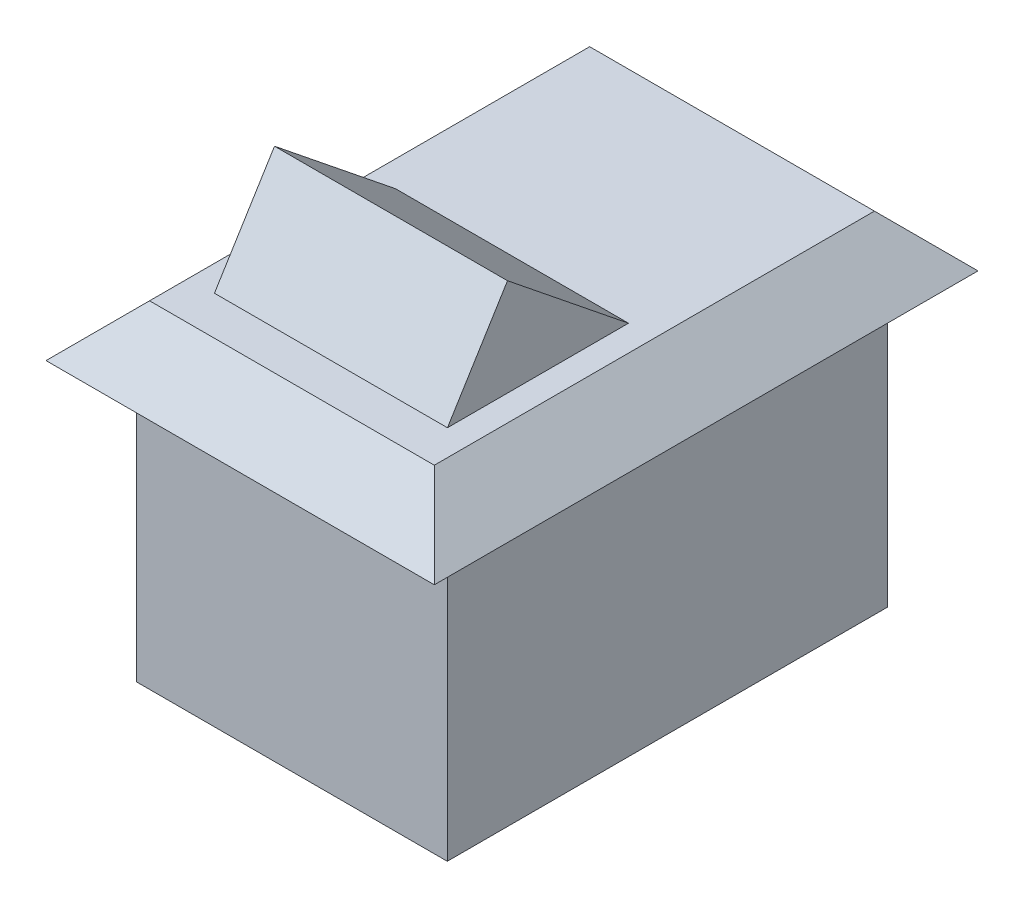
ISO-10303-21;
HEADER;
FILE_DESCRIPTION(('STEP AP214'),'2;1');
FILE_NAME('part.step','',(''),(''),'','','');
FILE_SCHEMA(('AUTOMOTIVE_DESIGN { 1 0 10303 214 1 1 1 1 }'));
ENDSEC;
DATA;
#1=APPLICATION_CONTEXT('core data for automotive mechanical design processes');
#2=APPLICATION_PROTOCOL_DEFINITION('international standard','automotive_design',2000,#1);
#3=PRODUCT_CONTEXT('',#1,'mechanical');
#4=PRODUCT('Part','Part','',(#3));
#5=PRODUCT_RELATED_PRODUCT_CATEGORY('part','',(#4));
#6=PRODUCT_DEFINITION_FORMATION('','',#4);
#7=PRODUCT_DEFINITION_CONTEXT('part definition',#1,'design');
#8=PRODUCT_DEFINITION('design','',#6,#7);
#9=PRODUCT_DEFINITION_SHAPE('','',#8);
#10=(LENGTH_UNIT() NAMED_UNIT(*) SI_UNIT(.MILLI.,.METRE.));
#11=(NAMED_UNIT(*) PLANE_ANGLE_UNIT() SI_UNIT($,.RADIAN.));
#12=(NAMED_UNIT(*) SI_UNIT($,.STERADIAN.) SOLID_ANGLE_UNIT());
#13=UNCERTAINTY_MEASURE_WITH_UNIT(LENGTH_MEASURE(1.E-05),#10,'distance_accuracy_value','');
#14=(GEOMETRIC_REPRESENTATION_CONTEXT(3) GLOBAL_UNCERTAINTY_ASSIGNED_CONTEXT((#13)) GLOBAL_UNIT_ASSIGNED_CONTEXT((#10,
#11,#12)) REPRESENTATION_CONTEXT('',''));
#15=CARTESIAN_POINT('',(0.,0.,0.));
#16=DIRECTION('',(0.,0.,1.));
#17=DIRECTION('',(1.,0.,0.));
#18=AXIS2_PLACEMENT_3D('',#15,#16,#17);
#19=CARTESIAN_POINT('',(0.,13.,0.));
#20=DIRECTION('',(0.,-1.,0.));
#21=DIRECTION('',(0.,0.,-1.));
#22=AXIS2_PLACEMENT_3D('',#19,#20,#21);
#23=PLANE('',#22);
#24=DIRECTION('',(0.,0.,-1.));
#25=VECTOR('',#24,1.);
#26=CARTESIAN_POINT('',(5.49999999999999,13.,0.));
#27=LINE('',#26,#25);
#28=CARTESIAN_POINT('',(5.49999999999999,13.,8.49999999999999));
#29=VERTEX_POINT('',#28);
#30=CARTESIAN_POINT('',(5.49999999999999,13.,-8.5));
#31=VERTEX_POINT('',#30);
#32=EDGE_CURVE('E44',#29,#31,#27,.T.);
#33=ORIENTED_EDGE('',*,*,#32,.T.);
#34=DIRECTION('',(-1.,0.,0.));
#35=VECTOR('',#34,1.);
#36=CARTESIAN_POINT('',(0.,13.,-8.5));
#37=LINE('',#36,#35);
#38=CARTESIAN_POINT('',(-5.5,13.,-8.5));
#39=VERTEX_POINT('',#38);
#40=EDGE_CURVE('E11',#31,#39,#37,.T.);
#41=ORIENTED_EDGE('',*,*,#40,.T.);
#42=DIRECTION('',(0.,0.,1.));
#43=VECTOR('',#42,1.);
#44=CARTESIAN_POINT('',(-5.5,13.,0.));
#45=LINE('',#44,#43);
#46=CARTESIAN_POINT('',(-5.5,13.,8.49999999999999));
#47=VERTEX_POINT('',#46);
#48=EDGE_CURVE('E190',#39,#47,#45,.T.);
#49=ORIENTED_EDGE('',*,*,#48,.T.);
#50=DIRECTION('',(1.,0.,0.));
#51=VECTOR('',#50,1.);
#52=CARTESIAN_POINT('',(0.,13.,8.49999999999999));
#53=LINE('',#52,#51);
#54=EDGE_CURVE('E192',#47,#29,#53,.T.);
#55=ORIENTED_EDGE('',*,*,#54,.T.);
#56=EDGE_LOOP('',(#33,#41,#49,#55));
#57=FACE_BOUND('',#56,.T.);
#58=DIRECTION('',(0.,0.,-1.));
#59=VECTOR('',#58,1.);
#60=CARTESIAN_POINT('',(4.5,13.,0.));
#61=LINE('',#60,#59);
#62=CARTESIAN_POINT('',(4.5,13.,6.99358473484899));
#63=VERTEX_POINT('',#62);
#64=CARTESIAN_POINT('',(4.5,13.,0.));
#65=VERTEX_POINT('',#64);
#66=EDGE_CURVE('E125',#63,#65,#61,.T.);
#67=ORIENTED_EDGE('',*,*,#66,.F.);
#68=DIRECTION('',(-1.,0.,0.));
#69=VECTOR('',#68,1.);
#70=CARTESIAN_POINT('',(4.5,13.,6.99358473484899));
#71=LINE('',#70,#69);
#72=CARTESIAN_POINT('',(-4.5,13.,6.99358473484899));
#73=VERTEX_POINT('',#72);
#74=EDGE_CURVE('E141',#63,#73,#71,.T.);
#75=ORIENTED_EDGE('',*,*,#74,.T.);
#76=DIRECTION('',(0.,0.,-1.));
#77=VECTOR('',#76,1.);
#78=CARTESIAN_POINT('',(-4.5,13.,0.));
#79=LINE('',#78,#77);
#80=CARTESIAN_POINT('',(-4.5,13.,0.));
#81=VERTEX_POINT('',#80);
#82=EDGE_CURVE('E136',#73,#81,#79,.T.);
#83=ORIENTED_EDGE('',*,*,#82,.T.);
#84=DIRECTION('',(-1.,0.,0.));
#85=VECTOR('',#84,1.);
#86=CARTESIAN_POINT('',(4.5,13.,0.));
#87=LINE('',#86,#85);
#88=EDGE_CURVE('E52',#65,#81,#87,.T.);
#89=ORIENTED_EDGE('',*,*,#88,.F.);
#90=EDGE_LOOP('',(#67,#75,#83,#89));
#91=FACE_BOUND('',#90,.T.);
#92=ADVANCED_FACE('F35',(#57,#91),#23,.F.);
#93=CARTESIAN_POINT('',(6.,11.,8.5));
#94=DIRECTION('',(-1.,0.,0.));
#95=DIRECTION('',(0.,0.,1.));
#96=AXIS2_PLACEMENT_3D('',#93,#94,#95);
#97=PLANE('',#96);
#98=DIRECTION('',(0.,0.,-1.));
#99=VECTOR('',#98,1.);
#100=CARTESIAN_POINT('',(6.,0.,8.5));
#101=LINE('',#100,#99);
#102=CARTESIAN_POINT('',(6.,0.,8.5));
#103=VERTEX_POINT('',#102);
#104=CARTESIAN_POINT('',(6.,0.,-8.5));
#105=VERTEX_POINT('',#104);
#106=EDGE_CURVE('E157',#103,#105,#101,.T.);
#107=ORIENTED_EDGE('',*,*,#106,.T.);
#108=DIRECTION('',(0.,-1.,0.));
#109=VECTOR('',#108,1.);
#110=CARTESIAN_POINT('',(6.,11.,-8.5));
#111=LINE('',#110,#109);
#112=CARTESIAN_POINT('',(6.,11.,-8.5));
#113=VERTEX_POINT('',#112);
#114=EDGE_CURVE('E187',#113,#105,#111,.T.);
#115=ORIENTED_EDGE('',*,*,#114,.F.);
#116=DIRECTION('',(0.,0.,-1.));
#117=VECTOR('',#116,1.);
#118=CARTESIAN_POINT('',(6.,11.,8.5));
#119=LINE('',#118,#117);
#120=CARTESIAN_POINT('',(6.,11.,8.5));
#121=VERTEX_POINT('',#120);
#122=EDGE_CURVE('E158',#121,#113,#119,.T.);
#123=ORIENTED_EDGE('',*,*,#122,.F.);
#124=DIRECTION('',(0.,-1.,0.));
#125=VECTOR('',#124,1.);
#126=CARTESIAN_POINT('',(6.,11.,8.5));
#127=LINE('',#126,#125);
#128=EDGE_CURVE('E171',#121,#103,#127,.T.);
#129=ORIENTED_EDGE('',*,*,#128,.T.);
#130=EDGE_LOOP('',(#107,#115,#123,#129));
#131=FACE_BOUND('',#130,.T.);
#132=ADVANCED_FACE('F216',(#131),#97,.F.);
#133=CARTESIAN_POINT('',(-6.,11.,-8.5));
#134=DIRECTION('',(0.,0.,1.));
#135=DIRECTION('',(1.,0.,0.));
#136=AXIS2_PLACEMENT_3D('',#133,#134,#135);
#137=PLANE('',#136);
#138=DIRECTION('',(-1.,0.,0.));
#139=VECTOR('',#138,1.);
#140=CARTESIAN_POINT('',(-6.,0.,-8.5));
#141=LINE('',#140,#139);
#142=CARTESIAN_POINT('',(-6.,0.,-8.5));
#143=VERTEX_POINT('',#142);
#144=EDGE_CURVE('E174',#105,#143,#141,.T.);
#145=ORIENTED_EDGE('',*,*,#144,.T.);
#146=DIRECTION('',(0.,-1.,0.));
#147=VECTOR('',#146,1.);
#148=CARTESIAN_POINT('',(-6.,11.,-8.5));
#149=LINE('',#148,#147);
#150=CARTESIAN_POINT('',(-6.,11.,-8.5));
#151=VERTEX_POINT('',#150);
#152=EDGE_CURVE('E184',#151,#143,#149,.T.);
#153=ORIENTED_EDGE('',*,*,#152,.F.);
#154=DIRECTION('',(-1.,0.,0.));
#155=VECTOR('',#154,1.);
#156=CARTESIAN_POINT('',(-6.,11.,-8.5));
#157=LINE('',#156,#155);
#158=EDGE_CURVE('E161',#113,#151,#157,.T.);
#159=ORIENTED_EDGE('',*,*,#158,.F.);
#160=ORIENTED_EDGE('',*,*,#114,.T.);
#161=EDGE_LOOP('',(#145,#153,#159,#160));
#162=FACE_BOUND('',#161,.T.);
#163=ADVANCED_FACE('F221',(#162),#137,.F.);
#164=CARTESIAN_POINT('',(-6.,11.,8.5));
#165=DIRECTION('',(1.,0.,0.));
#166=DIRECTION('',(0.,0.,-1.));
#167=AXIS2_PLACEMENT_3D('',#164,#165,#166);
#168=PLANE('',#167);
#169=DIRECTION('',(0.,0.,1.));
#170=VECTOR('',#169,1.);
#171=CARTESIAN_POINT('',(-6.,0.,8.5));
#172=LINE('',#171,#170);
#173=CARTESIAN_POINT('',(-6.,0.,8.5));
#174=VERTEX_POINT('',#173);
#175=EDGE_CURVE('E176',#143,#174,#172,.T.);
#176=ORIENTED_EDGE('',*,*,#175,.T.);
#177=DIRECTION('',(0.,-1.,0.));
#178=VECTOR('',#177,1.);
#179=CARTESIAN_POINT('',(-6.,11.,8.5));
#180=LINE('',#179,#178);
#181=CARTESIAN_POINT('',(-6.,11.,8.5));
#182=VERTEX_POINT('',#181);
#183=EDGE_CURVE('E181',#182,#174,#180,.T.);
#184=ORIENTED_EDGE('',*,*,#183,.F.);
#185=DIRECTION('',(0.,0.,1.));
#186=VECTOR('',#185,1.);
#187=CARTESIAN_POINT('',(-6.,11.,8.5));
#188=LINE('',#187,#186);
#189=EDGE_CURVE('E165',#151,#182,#188,.T.);
#190=ORIENTED_EDGE('',*,*,#189,.F.);
#191=ORIENTED_EDGE('',*,*,#152,.T.);
#192=EDGE_LOOP('',(#176,#184,#190,#191));
#193=FACE_BOUND('',#192,.T.);
#194=ADVANCED_FACE('F236',(#193),#168,.F.);
#195=CARTESIAN_POINT('',(-6.,11.,8.5));
#196=DIRECTION('',(0.,0.,-1.));
#197=DIRECTION('',(-1.,0.,0.));
#198=AXIS2_PLACEMENT_3D('',#195,#196,#197);
#199=PLANE('',#198);
#200=DIRECTION('',(1.,0.,0.));
#201=VECTOR('',#200,1.);
#202=CARTESIAN_POINT('',(-6.,0.,8.5));
#203=LINE('',#202,#201);
#204=EDGE_CURVE('E162',#174,#103,#203,.T.);
#205=ORIENTED_EDGE('',*,*,#204,.T.);
#206=ORIENTED_EDGE('',*,*,#128,.F.);
#207=DIRECTION('',(1.,0.,0.));
#208=VECTOR('',#207,1.);
#209=CARTESIAN_POINT('',(-6.,11.,8.5));
#210=LINE('',#209,#208);
#211=EDGE_CURVE('E168',#182,#121,#210,.T.);
#212=ORIENTED_EDGE('',*,*,#211,.F.);
#213=ORIENTED_EDGE('',*,*,#183,.T.);
#214=EDGE_LOOP('',(#205,#206,#212,#213));
#215=FACE_BOUND('',#214,.T.);
#216=ADVANCED_FACE('F232',(#215),#199,.F.);
#217=CARTESIAN_POINT('',(0.,0.,0.));
#218=DIRECTION('',(0.,-1.,0.));
#219=DIRECTION('',(0.,0.,-1.));
#220=AXIS2_PLACEMENT_3D('',#217,#218,#219);
#221=PLANE('',#220);
#222=ORIENTED_EDGE('',*,*,#106,.F.);
#223=ORIENTED_EDGE('',*,*,#204,.F.);
#224=ORIENTED_EDGE('',*,*,#175,.F.);
#225=ORIENTED_EDGE('',*,*,#144,.F.);
#226=EDGE_LOOP('',(#222,#223,#224,#225));
#227=FACE_BOUND('',#226,.T.);
#228=ADVANCED_FACE('F229',(#227),#221,.T.);
#229=CARTESIAN_POINT('',(0.,11.,0.));
#230=DIRECTION('',(0.,-1.,0.));
#231=DIRECTION('',(0.,0.,-1.));
#232=AXIS2_PLACEMENT_3D('',#229,#230,#231);
#233=PLANE('',#232);
#234=DIRECTION('',(0.,0.,-1.));
#235=VECTOR('',#234,1.);
#236=CARTESIAN_POINT('',(7.5,11.,10.5));
#237=LINE('',#236,#235);
#238=CARTESIAN_POINT('',(7.5,11.,10.5));
#239=VERTEX_POINT('',#238);
#240=CARTESIAN_POINT('',(7.5,11.,-10.5));
#241=VERTEX_POINT('',#240);
#242=EDGE_CURVE('E145',#239,#241,#237,.T.);
#243=ORIENTED_EDGE('',*,*,#242,.F.);
#244=DIRECTION('',(1.,0.,0.));
#245=VECTOR('',#244,1.);
#246=CARTESIAN_POINT('',(-7.5,11.,10.5));
#247=LINE('',#246,#245);
#248=CARTESIAN_POINT('',(-7.5,11.,10.5));
#249=VERTEX_POINT('',#248);
#250=EDGE_CURVE('E154',#249,#239,#247,.T.);
#251=ORIENTED_EDGE('',*,*,#250,.F.);
#252=DIRECTION('',(0.,0.,1.));
#253=VECTOR('',#252,1.);
#254=CARTESIAN_POINT('',(-7.5,11.,10.5));
#255=LINE('',#254,#253);
#256=CARTESIAN_POINT('',(-7.5,11.,-10.5));
#257=VERTEX_POINT('',#256);
#258=EDGE_CURVE('E151',#257,#249,#255,.T.);
#259=ORIENTED_EDGE('',*,*,#258,.F.);
#260=DIRECTION('',(-1.,0.,0.));
#261=VECTOR('',#260,1.);
#262=CARTESIAN_POINT('',(-7.5,11.,-10.5));
#263=LINE('',#262,#261);
#264=EDGE_CURVE('E148',#241,#257,#263,.T.);
#265=ORIENTED_EDGE('',*,*,#264,.F.);
#266=EDGE_LOOP('',(#243,#251,#259,#265));
#267=FACE_BOUND('',#266,.T.);
#268=ORIENTED_EDGE('',*,*,#122,.T.);
#269=ORIENTED_EDGE('',*,*,#158,.T.);
#270=ORIENTED_EDGE('',*,*,#189,.T.);
#271=ORIENTED_EDGE('',*,*,#211,.T.);
#272=EDGE_LOOP('',(#268,#269,#270,#271));
#273=FACE_BOUND('',#272,.T.);
#274=ADVANCED_FACE('F208',(#267,#273),#233,.T.);
#275=CARTESIAN_POINT('',(0.,13.,8.49999999999999));
#276=DIRECTION('',(0.,-0.707106781186547,-0.707106781186548));
#277=DIRECTION('',(1.,0.,0.));
#278=AXIS2_PLACEMENT_3D('',#275,#276,#277);
#279=PLANE('',#278);
#280=DIRECTION('',(0.577350269189625,0.577350269189626,-0.577350269189625));
#281=VECTOR('',#280,1.);
#282=CARTESIAN_POINT('',(-2.66666666666667,15.8333333333333,5.66666666666667));
#283=LINE('',#282,#281);
#284=EDGE_CURVE('E195',#249,#47,#283,.T.);
#285=ORIENTED_EDGE('',*,*,#284,.F.);
#286=ORIENTED_EDGE('',*,*,#250,.T.);
#287=DIRECTION('',(-0.577350269189625,0.577350269189626,-0.577350269189625));
#288=VECTOR('',#287,1.);
#289=CARTESIAN_POINT('',(3.66666666666667,14.8333333333333,6.66666666666666));
#290=LINE('',#289,#288);
#291=EDGE_CURVE('E39',#29,#239,#290,.F.);
#292=ORIENTED_EDGE('',*,*,#291,.F.);
#293=ORIENTED_EDGE('',*,*,#54,.F.);
#294=EDGE_LOOP('',(#285,#286,#292,#293));
#295=FACE_BOUND('',#294,.T.);
#296=ADVANCED_FACE('F37',(#295),#279,.F.);
#297=CARTESIAN_POINT('',(5.49999999999999,13.,0.));
#298=DIRECTION('',(-0.707106781186548,-0.707106781186547,0.));
#299=DIRECTION('',(0.,0.,-1.));
#300=AXIS2_PLACEMENT_3D('',#297,#298,#299);
#301=PLANE('',#300);
#302=ORIENTED_EDGE('',*,*,#291,.T.);
#303=ORIENTED_EDGE('',*,*,#242,.T.);
#304=DIRECTION('',(-0.577350269189625,0.577350269189626,0.577350269189625));
#305=VECTOR('',#304,1.);
#306=CARTESIAN_POINT('',(2.66666666666666,15.8333333333333,-5.66666666666667));
#307=LINE('',#306,#305);
#308=EDGE_CURVE('E139',#31,#241,#307,.F.);
#309=ORIENTED_EDGE('',*,*,#308,.F.);
#310=ORIENTED_EDGE('',*,*,#32,.F.);
#311=EDGE_LOOP('',(#302,#303,#309,#310));
#312=FACE_BOUND('',#311,.T.);
#313=ADVANCED_FACE('F203',(#312),#301,.F.);
#314=CARTESIAN_POINT('',(-5.5,13.,0.));
#315=DIRECTION('',(0.707106781186548,-0.707106781186547,0.));
#316=DIRECTION('',(0.,0.,1.));
#317=AXIS2_PLACEMENT_3D('',#314,#315,#316);
#318=PLANE('',#317);
#319=ORIENTED_EDGE('',*,*,#284,.T.);
#320=ORIENTED_EDGE('',*,*,#48,.F.);
#321=DIRECTION('',(-0.577350269189625,-0.577350269189626,-0.577350269189625));
#322=VECTOR('',#321,1.);
#323=CARTESIAN_POINT('',(-2.66666666666667,15.8333333333333,-5.66666666666667));
#324=LINE('',#323,#322);
#325=EDGE_CURVE('E137',#257,#39,#324,.F.);
#326=ORIENTED_EDGE('',*,*,#325,.F.);
#327=ORIENTED_EDGE('',*,*,#258,.T.);
#328=EDGE_LOOP('',(#319,#320,#326,#327));
#329=FACE_BOUND('',#328,.T.);
#330=ADVANCED_FACE('F214',(#329),#318,.F.);
#331=CARTESIAN_POINT('',(0.,13.,-8.5));
#332=DIRECTION('',(0.,-0.707106781186547,0.707106781186548));
#333=DIRECTION('',(-1.,0.,0.));
#334=AXIS2_PLACEMENT_3D('',#331,#332,#333);
#335=PLANE('',#334);
#336=ORIENTED_EDGE('',*,*,#308,.T.);
#337=ORIENTED_EDGE('',*,*,#264,.T.);
#338=ORIENTED_EDGE('',*,*,#325,.T.);
#339=ORIENTED_EDGE('',*,*,#40,.F.);
#340=EDGE_LOOP('',(#336,#337,#338,#339));
#341=FACE_BOUND('',#340,.T.);
#342=ADVANCED_FACE('F212',(#341),#335,.F.);
#343=CARTESIAN_POINT('',(4.5,16.7582958809729,4.67390817820371));
#344=DIRECTION('',(0.,-0.779307249256182,0.626642012042572));
#345=DIRECTION('',(0.,-0.626642012042572,-0.779307249256182));
#346=AXIS2_PLACEMENT_3D('',#343,#344,#345);
#347=PLANE('',#346);
#348=DIRECTION('',(0.,0.626642012042572,0.779307249256182));
#349=VECTOR('',#348,1.);
#350=CARTESIAN_POINT('',(-4.5,16.7582958809729,4.67390817820371));
#351=LINE('',#350,#349);
#352=CARTESIAN_POINT('',(-4.5,16.7582958809729,4.67390817820371));
#353=VERTEX_POINT('',#352);
#354=EDGE_CURVE('E348',#81,#353,#351,.T.);
#355=ORIENTED_EDGE('',*,*,#354,.T.);
#356=DIRECTION('',(-1.,0.,0.));
#357=VECTOR('',#356,1.);
#358=CARTESIAN_POINT('',(4.5,16.7582958809729,4.67390817820371));
#359=LINE('',#358,#357);
#360=CARTESIAN_POINT('',(4.5,16.7582958809729,4.67390817820371));
#361=VERTEX_POINT('',#360);
#362=EDGE_CURVE('E121',#361,#353,#359,.T.);
#363=ORIENTED_EDGE('',*,*,#362,.F.);
#364=DIRECTION('',(0.,0.626642012042572,0.779307249256182));
#365=VECTOR('',#364,1.);
#366=CARTESIAN_POINT('',(4.5,16.7582958809729,4.67390817820371));
#367=LINE('',#366,#365);
#368=EDGE_CURVE('E117',#65,#361,#367,.T.);
#369=ORIENTED_EDGE('',*,*,#368,.F.);
#370=ORIENTED_EDGE('',*,*,#88,.T.);
#371=EDGE_LOOP('',(#355,#363,#369,#370));
#372=FACE_BOUND('',#371,.T.);
#373=ADVANCED_FACE('F119',(#372),#347,.F.);
#374=CARTESIAN_POINT('',(4.5,13.,6.99358473484899));
#375=DIRECTION('',(0.,-0.525226711649115,-0.850962338397098));
#376=DIRECTION('',(0.,0.850962338397098,-0.525226711649115));
#377=AXIS2_PLACEMENT_3D('',#374,#375,#376);
#378=PLANE('',#377);
#379=DIRECTION('',(0.,-0.850962338397098,0.525226711649115));
#380=VECTOR('',#379,1.);
#381=CARTESIAN_POINT('',(-4.5,13.,6.99358473484899));
#382=LINE('',#381,#380);
#383=EDGE_CURVE('E132',#353,#73,#382,.T.);
#384=ORIENTED_EDGE('',*,*,#383,.T.);
#385=ORIENTED_EDGE('',*,*,#74,.F.);
#386=DIRECTION('',(0.,-0.850962338397098,0.525226711649115));
#387=VECTOR('',#386,1.);
#388=CARTESIAN_POINT('',(4.5,13.,6.99358473484899));
#389=LINE('',#388,#387);
#390=EDGE_CURVE('E124',#361,#63,#389,.T.);
#391=ORIENTED_EDGE('',*,*,#390,.F.);
#392=ORIENTED_EDGE('',*,*,#362,.T.);
#393=EDGE_LOOP('',(#384,#385,#391,#392));
#394=FACE_BOUND('',#393,.T.);
#395=ADVANCED_FACE('F317',(#394),#378,.F.);
#396=CARTESIAN_POINT('',(4.5,0.,0.));
#397=DIRECTION('',(-1.,0.,0.));
#398=DIRECTION('',(0.,0.,1.));
#399=AXIS2_PLACEMENT_3D('',#396,#397,#398);
#400=PLANE('',#399);
#401=ORIENTED_EDGE('',*,*,#66,.T.);
#402=ORIENTED_EDGE('',*,*,#368,.T.);
#403=ORIENTED_EDGE('',*,*,#390,.T.);
#404=EDGE_LOOP('',(#401,#402,#403));
#405=FACE_BOUND('',#404,.T.);
#406=ADVANCED_FACE('F128',(#405),#400,.F.);
#407=CARTESIAN_POINT('',(-4.5,0.,0.));
#408=DIRECTION('',(-1.,0.,0.));
#409=DIRECTION('',(0.,0.,1.));
#410=AXIS2_PLACEMENT_3D('',#407,#408,#409);
#411=PLANE('',#410);
#412=ORIENTED_EDGE('',*,*,#82,.F.);
#413=ORIENTED_EDGE('',*,*,#383,.F.);
#414=ORIENTED_EDGE('',*,*,#354,.F.);
#415=EDGE_LOOP('',(#412,#413,#414));
#416=FACE_BOUND('',#415,.T.);
#417=ADVANCED_FACE('F331',(#416),#411,.T.);
#418=CLOSED_SHELL('',(#92,#132,#163,#194,#216,#228,#274,#296,#313,#330,#342,#373,#395,#406,#417));
#419=MANIFOLD_SOLID_BREP('B2',#418);
#420=ADVANCED_BREP_SHAPE_REPRESENTATION('',(#18,#419),#14);
#421=SHAPE_DEFINITION_REPRESENTATION(#9,#420);
ENDSEC;
END-ISO-10303-21;
